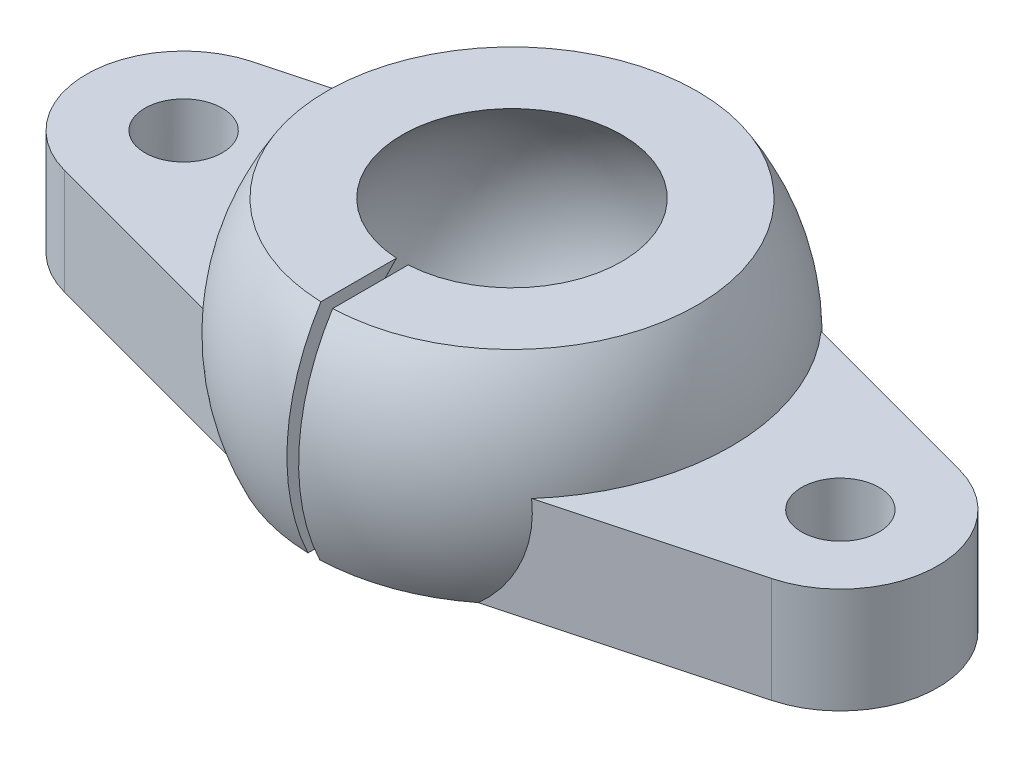
ISO-10303-21;
HEADER;
FILE_DESCRIPTION(('STEP AP214'),'2;1');
FILE_NAME('part.step','',(''),(''),'','','');
FILE_SCHEMA(('AUTOMOTIVE_DESIGN { 1 0 10303 214 1 1 1 1 }'));
ENDSEC;
DATA;
#1=APPLICATION_CONTEXT('core data for automotive mechanical design processes');
#2=APPLICATION_PROTOCOL_DEFINITION('international standard','automotive_design',2000,#1);
#3=PRODUCT_CONTEXT('',#1,'mechanical');
#4=PRODUCT('Part','Part','',(#3));
#5=PRODUCT_RELATED_PRODUCT_CATEGORY('part','',(#4));
#6=PRODUCT_DEFINITION_FORMATION('','',#4);
#7=PRODUCT_DEFINITION_CONTEXT('part definition',#1,'design');
#8=PRODUCT_DEFINITION('design','',#6,#7);
#9=PRODUCT_DEFINITION_SHAPE('','',#8);
#10=(LENGTH_UNIT() NAMED_UNIT(*) SI_UNIT(.MILLI.,.METRE.));
#11=(NAMED_UNIT(*) PLANE_ANGLE_UNIT() SI_UNIT($,.RADIAN.));
#12=(NAMED_UNIT(*) SI_UNIT($,.STERADIAN.) SOLID_ANGLE_UNIT());
#13=UNCERTAINTY_MEASURE_WITH_UNIT(LENGTH_MEASURE(1.E-05),#10,'distance_accuracy_value','');
#14=(GEOMETRIC_REPRESENTATION_CONTEXT(3) GLOBAL_UNCERTAINTY_ASSIGNED_CONTEXT((#13)) GLOBAL_UNIT_ASSIGNED_CONTEXT((#10,
#11,#12)) REPRESENTATION_CONTEXT('',''));
#15=CARTESIAN_POINT('',(0.,0.,0.));
#16=DIRECTION('',(0.,0.,1.));
#17=DIRECTION('',(1.,0.,0.));
#18=AXIS2_PLACEMENT_3D('',#15,#16,#17);
#19=CARTESIAN_POINT('',(0.,0.,0.));
#20=DIRECTION('',(0.,1.,0.));
#21=DIRECTION('',(-1.,0.,0.));
#22=AXIS2_PLACEMENT_3D('',#19,#20,#21);
#23=SPHERICAL_SURFACE('',#22,6.85);
#24=CARTESIAN_POINT('',(-0.25,0.,0.));
#25=DIRECTION('',(-1.,0.,0.));
#26=DIRECTION('',(0.,-1.,0.));
#27=AXIS2_PLACEMENT_3D('',#24,#25,#26);
#28=CIRCLE('',#27,6.84543643604993);
#29=CARTESIAN_POINT('',(-0.25,-3.56370593624109,5.84465567848098));
#30=VERTEX_POINT('',#29);
#31=CARTESIAN_POINT('',(-0.250000000000003,5.,4.67546789102438));
#32=VERTEX_POINT('',#31);
#33=EDGE_CURVE('E307',#30,#32,#28,.T.);
#34=ORIENTED_EDGE('',*,*,#33,.F.);
#35=CARTESIAN_POINT('',(0.,-3.56370593624109,0.));
#36=DIRECTION('',(0.,1.,0.));
#37=DIRECTION('',(-1.,0.,0.));
#38=AXIS2_PLACEMENT_3D('',#35,#36,#37);
#39=CIRCLE('',#38,5.85);
#40=CARTESIAN_POINT('',(0.25,-3.56370593624109,5.84465567848098));
#41=VERTEX_POINT('',#40);
#42=EDGE_CURVE('E303',#41,#30,#39,.T.);
#43=ORIENTED_EDGE('',*,*,#42,.F.);
#44=CARTESIAN_POINT('',(0.25,0.,0.));
#45=DIRECTION('',(-1.,0.,0.));
#46=DIRECTION('',(0.,-1.,0.));
#47=AXIS2_PLACEMENT_3D('',#44,#45,#46);
#48=CIRCLE('',#47,6.84543643604993);
#49=CARTESIAN_POINT('',(0.249999999999997,5.,4.67546789102438));
#50=VERTEX_POINT('',#49);
#51=EDGE_CURVE('E64',#41,#50,#48,.T.);
#52=ORIENTED_EDGE('',*,*,#51,.T.);
#53=CARTESIAN_POINT('',(0.,5.,0.));
#54=DIRECTION('',(0.,1.,0.));
#55=DIRECTION('',(-1.,0.,0.));
#56=AXIS2_PLACEMENT_3D('',#53,#54,#55);
#57=CIRCLE('',#56,4.68214694344378);
#58=EDGE_CURVE('E167',#50,#32,#57,.T.);
#59=ORIENTED_EDGE('',*,*,#58,.T.);
#60=EDGE_LOOP('',(#34,#43,#52,#59));
#61=FACE_BOUND('',#60,.T.);
#62=ADVANCED_FACE('F35',(#61),#23,.F.);
#63=CARTESIAN_POINT('',(-7.90079109963047,5.,0.));
#64=DIRECTION('',(0.,1.,0.));
#65=DIRECTION('',(-1.,0.,0.));
#66=AXIS2_PLACEMENT_3D('',#63,#64,#65);
#67=PLANE('',#66);
#68=DIRECTION('',(0.,0.,1.));
#69=VECTOR('',#68,1.);
#70=CARTESIAN_POINT('',(-0.250000000000001,5.,0.));
#71=LINE('',#70,#69);
#72=CARTESIAN_POINT('',(-0.250000000000003,5.,7.89683480895985));
#73=VERTEX_POINT('',#72);
#74=EDGE_CURVE('E137',#32,#73,#71,.T.);
#75=ORIENTED_EDGE('',*,*,#74,.F.);
#76=ORIENTED_EDGE('',*,*,#58,.F.);
#77=DIRECTION('',(0.,0.,1.));
#78=VECTOR('',#77,1.);
#79=CARTESIAN_POINT('',(0.249999999999999,5.,0.));
#80=LINE('',#79,#78);
#81=CARTESIAN_POINT('',(0.249999999999997,5.,7.89683480895985));
#82=VERTEX_POINT('',#81);
#83=EDGE_CURVE('E312',#50,#82,#80,.T.);
#84=ORIENTED_EDGE('',*,*,#83,.T.);
#85=CARTESIAN_POINT('',(0.,5.,0.));
#86=DIRECTION('',(0.,1.,0.));
#87=DIRECTION('',(-1.,0.,0.));
#88=AXIS2_PLACEMENT_3D('',#85,#86,#87);
#89=CIRCLE('',#88,7.90079109963047);
#90=EDGE_CURVE('E162',#82,#73,#89,.T.);
#91=ORIENTED_EDGE('',*,*,#90,.T.);
#92=EDGE_LOOP('',(#75,#76,#84,#91));
#93=FACE_BOUND('',#92,.T.);
#94=ADVANCED_FACE('F245',(#93),#67,.T.);
#95=CARTESIAN_POINT('',(0.,0.,0.));
#96=DIRECTION('',(0.,1.,0.));
#97=DIRECTION('',(-1.,0.,0.));
#98=AXIS2_PLACEMENT_3D('',#95,#96,#97);
#99=SPHERICAL_SURFACE('',#98,9.35);
#100=CARTESIAN_POINT('',(-0.25,0.,0.));
#101=DIRECTION('',(-1.,0.,0.));
#102=DIRECTION('',(0.,-1.,0.));
#103=AXIS2_PLACEMENT_3D('',#100,#101,#102);
#104=CIRCLE('',#103,9.34665715643834);
#105=CARTESIAN_POINT('',(-0.250000000000001,-4.00000000000001,8.44748483277715));
#106=VERTEX_POINT('',#105);
#107=EDGE_CURVE('E134',#73,#106,#104,.F.);
#108=ORIENTED_EDGE('',*,*,#107,.F.);
#109=ORIENTED_EDGE('',*,*,#90,.F.);
#110=CARTESIAN_POINT('',(0.25,0.,0.));
#111=DIRECTION('',(-1.,0.,0.));
#112=DIRECTION('',(0.,-1.,0.));
#113=AXIS2_PLACEMENT_3D('',#110,#111,#112);
#114=CIRCLE('',#113,9.34665715643834);
#115=CARTESIAN_POINT('',(0.249999999999999,-4.00000000000001,8.44748483277715));
#116=VERTEX_POINT('',#115);
#117=EDGE_CURVE('E308',#82,#116,#114,.F.);
#118=ORIENTED_EDGE('',*,*,#117,.T.);
#119=CARTESIAN_POINT('',(0.,-4.,0.));
#120=DIRECTION('',(0.,1.,0.));
#121=DIRECTION('',(-1.,0.,0.));
#122=AXIS2_PLACEMENT_3D('',#119,#120,#121);
#123=CIRCLE('',#122,8.45118334909378);
#124=CARTESIAN_POINT('',(5.21491093730875,-4.,6.65035366848543));
#125=VERTEX_POINT('',#124);
#126=EDGE_CURVE('E160',#116,#125,#123,.T.);
#127=ORIENTED_EDGE('',*,*,#126,.T.);
#128=CARTESIAN_POINT('',(2.01192121068436,0.,7.5085921790996));
#129=DIRECTION('',(0.258819045102518,0.,0.965925826289069));
#130=DIRECTION('',(0.965925826289069,0.,-0.258819045102518));
#131=AXIS2_PLACEMENT_3D('',#128,#129,#130);
#132=CIRCLE('',#131,5.19574022926114);
#133=CARTESIAN_POINT('',(7.00732842568334,0.500000000000003,6.17007684997604));
#134=VERTEX_POINT('',#133);
#135=EDGE_CURVE('E297',#134,#125,#132,.F.);
#136=ORIENTED_EDGE('',*,*,#135,.F.);
#137=CARTESIAN_POINT('',(0.,0.5,0.));
#138=DIRECTION('',(0.,-1.,0.));
#139=DIRECTION('',(1.,0.,0.));
#140=AXIS2_PLACEMENT_3D('',#137,#138,#139);
#141=CIRCLE('',#140,9.33662144461261);
#142=CARTESIAN_POINT('',(7.00732842568334,0.500000000000003,-6.17007684997604));
#143=VERTEX_POINT('',#142);
#144=EDGE_CURVE('E170',#134,#143,#141,.F.);
#145=ORIENTED_EDGE('',*,*,#144,.T.);
#146=CARTESIAN_POINT('',(2.01192121068436,0.,-7.5085921790996));
#147=DIRECTION('',(0.258819045102518,0.,-0.965925826289069));
#148=DIRECTION('',(-0.965925826289069,0.,-0.258819045102518));
#149=AXIS2_PLACEMENT_3D('',#146,#147,#148);
#150=CIRCLE('',#149,5.19574022926114);
#151=CARTESIAN_POINT('',(5.21491093730875,-4.,-6.65035366848543));
#152=VERTEX_POINT('',#151);
#153=EDGE_CURVE('E301',#152,#143,#150,.F.);
#154=ORIENTED_EDGE('',*,*,#153,.F.);
#155=CARTESIAN_POINT('',(-5.21491093730875,-4.,-6.65035366848543));
#156=VERTEX_POINT('',#155);
#157=EDGE_CURVE('E159',#152,#156,#123,.T.);
#158=ORIENTED_EDGE('',*,*,#157,.T.);
#159=CARTESIAN_POINT('',(-2.01192121068436,0.,-7.5085921790996));
#160=DIRECTION('',(-0.258819045102518,0.,-0.965925826289069));
#161=DIRECTION('',(-0.965925826289069,0.,0.258819045102518));
#162=AXIS2_PLACEMENT_3D('',#159,#160,#161);
#163=CIRCLE('',#162,5.19574022926114);
#164=CARTESIAN_POINT('',(-7.00732842568334,0.499999999999998,-6.17007684997604));
#165=VERTEX_POINT('',#164);
#166=EDGE_CURVE('E277',#165,#156,#163,.F.);
#167=ORIENTED_EDGE('',*,*,#166,.F.);
#168=CARTESIAN_POINT('',(0.,0.5,0.));
#169=DIRECTION('',(0.,-1.,0.));
#170=DIRECTION('',(1.,0.,0.));
#171=AXIS2_PLACEMENT_3D('',#168,#169,#170);
#172=CIRCLE('',#171,9.33662144461261);
#173=CARTESIAN_POINT('',(-7.00732842568334,0.499999999999998,6.17007684997604));
#174=VERTEX_POINT('',#173);
#175=EDGE_CURVE('E172',#165,#174,#172,.F.);
#176=ORIENTED_EDGE('',*,*,#175,.T.);
#177=CARTESIAN_POINT('',(-2.01192121068436,0.,7.50859217909961));
#178=DIRECTION('',(-0.258819045102518,0.,0.965925826289069));
#179=DIRECTION('',(0.965925826289069,0.,0.258819045102518));
#180=AXIS2_PLACEMENT_3D('',#177,#178,#179);
#181=CIRCLE('',#180,5.19574022926114);
#182=CARTESIAN_POINT('',(-5.21491093730875,-4.,6.65035366848543));
#183=VERTEX_POINT('',#182);
#184=EDGE_CURVE('E157',#183,#174,#181,.F.);
#185=ORIENTED_EDGE('',*,*,#184,.F.);
#186=EDGE_CURVE('E148',#183,#106,#123,.T.);
#187=ORIENTED_EDGE('',*,*,#186,.T.);
#188=EDGE_LOOP('',(#108,#109,#118,#127,#136,#145,#154,#158,#167,#176,#185,#187));
#189=FACE_BOUND('',#188,.T.);
#190=ADVANCED_FACE('F155',(#189),#99,.T.);
#191=CARTESIAN_POINT('',(-6.56619833921587,-4.,0.));
#192=DIRECTION('',(0.,-1.,0.));
#193=DIRECTION('',(1.,0.,0.));
#194=AXIS2_PLACEMENT_3D('',#191,#192,#193);
#195=PLANE('',#194);
#196=DIRECTION('',(0.,0.,1.));
#197=VECTOR('',#196,1.);
#198=CARTESIAN_POINT('',(-0.249999999999999,-4.00000000000001,0.));
#199=LINE('',#198,#197);
#200=CARTESIAN_POINT('',(-0.25,-4.,6.5614373905358));
#201=VERTEX_POINT('',#200);
#202=EDGE_CURVE('E56',#201,#106,#199,.T.);
#203=ORIENTED_EDGE('',*,*,#202,.T.);
#204=ORIENTED_EDGE('',*,*,#186,.F.);
#205=DIRECTION('',(-0.965925826289069,0.,-0.258819045102518));
#206=VECTOR('',#205,1.);
#207=CARTESIAN_POINT('',(-15.0740990371754,-4.,4.00859217909964));
#208=LINE('',#207,#206);
#209=CARTESIAN_POINT('',(-15.0740990371754,-4.,4.00859217909964));
#210=VERTEX_POINT('',#209);
#211=EDGE_CURVE('E323',#183,#210,#208,.T.);
#212=ORIENTED_EDGE('',*,*,#211,.T.);
#213=CARTESIAN_POINT('',(-14.,-4.,0.));
#214=DIRECTION('',(0.,-1.,0.));
#215=DIRECTION('',(1.,0.,0.));
#216=AXIS2_PLACEMENT_3D('',#213,#214,#215);
#217=CIRCLE('',#216,4.15);
#218=CARTESIAN_POINT('',(-15.0740990371754,-4.,-4.00859217909964));
#219=VERTEX_POINT('',#218);
#220=EDGE_CURVE('E318',#210,#219,#217,.T.);
#221=ORIENTED_EDGE('',*,*,#220,.T.);
#222=DIRECTION('',(0.965925826289069,0.,-0.258819045102518));
#223=VECTOR('',#222,1.);
#224=CARTESIAN_POINT('',(-3.37648299815732,-4.,-7.14295895012386));
#225=LINE('',#224,#223);
#226=EDGE_CURVE('E331',#219,#156,#225,.T.);
#227=ORIENTED_EDGE('',*,*,#226,.T.);
#228=ORIENTED_EDGE('',*,*,#157,.F.);
#229=DIRECTION('',(0.965925826289069,0.,0.258819045102518));
#230=VECTOR('',#229,1.);
#231=CARTESIAN_POINT('',(3.37648299815732,-4.,-7.14295895012386));
#232=LINE('',#231,#230);
#233=CARTESIAN_POINT('',(15.0740990371755,-3.99999999999999,-4.00859217909964));
#234=VERTEX_POINT('',#233);
#235=EDGE_CURVE('E285',#152,#234,#232,.T.);
#236=ORIENTED_EDGE('',*,*,#235,.T.);
#237=CARTESIAN_POINT('',(14.,-3.99999999999999,0.));
#238=DIRECTION('',(0.,-1.,0.));
#239=DIRECTION('',(1.,0.,0.));
#240=AXIS2_PLACEMENT_3D('',#237,#238,#239);
#241=CIRCLE('',#240,4.15);
#242=CARTESIAN_POINT('',(15.0740990371754,-3.99999999999999,4.00859217909964));
#243=VERTEX_POINT('',#242);
#244=EDGE_CURVE('E272',#234,#243,#241,.T.);
#245=ORIENTED_EDGE('',*,*,#244,.T.);
#246=DIRECTION('',(-0.965925826289069,0.,0.258819045102518));
#247=VECTOR('',#246,1.);
#248=CARTESIAN_POINT('',(15.0740990371754,-3.99999999999999,4.00859217909964));
#249=LINE('',#248,#247);
#250=EDGE_CURVE('E275',#243,#125,#249,.T.);
#251=ORIENTED_EDGE('',*,*,#250,.T.);
#252=ORIENTED_EDGE('',*,*,#126,.F.);
#253=DIRECTION('',(0.,0.,1.));
#254=VECTOR('',#253,1.);
#255=CARTESIAN_POINT('',(0.250000000000001,-4.00000000000001,0.));
#256=LINE('',#255,#254);
#257=CARTESIAN_POINT('',(0.25,-4.00000000000001,6.56143739053581));
#258=VERTEX_POINT('',#257);
#259=EDGE_CURVE('E153',#258,#116,#256,.T.);
#260=ORIENTED_EDGE('',*,*,#259,.F.);
#261=CARTESIAN_POINT('',(0.,-4.,0.));
#262=DIRECTION('',(0.,1.,0.));
#263=DIRECTION('',(-1.,0.,0.));
#264=AXIS2_PLACEMENT_3D('',#261,#262,#263);
#265=CIRCLE('',#264,6.56619833921587);
#266=EDGE_CURVE('E152',#258,#201,#265,.T.);
#267=ORIENTED_EDGE('',*,*,#266,.T.);
#268=EDGE_LOOP('',(#203,#204,#212,#221,#227,#228,#236,#245,#251,#252,#260,#267));
#269=FACE_BOUND('',#268,.T.);
#270=CARTESIAN_POINT('',(14.,-3.99999999999999,0.));
#271=DIRECTION('',(0.,-1.,0.));
#272=DIRECTION('',(1.,0.,0.));
#273=AXIS2_PLACEMENT_3D('',#270,#271,#272);
#274=CIRCLE('',#273,3.14999999999999);
#275=CARTESIAN_POINT('',(17.15,-3.99999999999999,0.));
#276=VERTEX_POINT('',#275);
#277=EDGE_CURVE('E180',#276,#276,#274,.F.);
#278=ORIENTED_EDGE('',*,*,#277,.T.);
#279=EDGE_LOOP('',(#278));
#280=FACE_BOUND('',#279,.T.);
#281=CARTESIAN_POINT('',(-14.,-4.,0.));
#282=DIRECTION('',(0.,-1.,0.));
#283=DIRECTION('',(1.,0.,0.));
#284=AXIS2_PLACEMENT_3D('',#281,#282,#283);
#285=CIRCLE('',#284,3.15000000000001);
#286=CARTESIAN_POINT('',(-10.85,-4.,0.));
#287=VERTEX_POINT('',#286);
#288=EDGE_CURVE('E177',#287,#287,#285,.F.);
#289=ORIENTED_EDGE('',*,*,#288,.T.);
#290=EDGE_LOOP('',(#289));
#291=FACE_BOUND('',#290,.T.);
#292=ADVANCED_FACE('F146',(#269,#280,#291),#195,.T.);
#293=CARTESIAN_POINT('',(0.,-4.,0.));
#294=DIRECTION('',(0.,-1.,0.));
#295=DIRECTION('',(1.,0.,0.));
#296=AXIS2_PLACEMENT_3D('',#293,#294,#295);
#297=CONICAL_SURFACE('',#296,6.56619833921587,1.02365378895935);
#298=CARTESIAN_POINT('',(-0.25,-4.0007,6.56258730886968));
#299=CARTESIAN_POINT('',(-0.25,-3.79203605968382,6.21979491039334));
#300=CARTESIAN_POINT('',(-0.25,-3.58338011025822,5.87699762131281));
#301=CARTESIAN_POINT('',(-0.25,-3.16612496373921,5.19136193314967));
#302=CARTESIAN_POINT('',(-0.25,-2.95752576748086,4.84852353355888));
#303=CARTESIAN_POINT('',(-0.25,-2.53926748953039,4.16087140498777));
#304=CARTESIAN_POINT('',(-0.25,-2.32960898600546,3.8160573244824));
#305=CARTESIAN_POINT('',(-0.25,-1.91049967216925,3.12630918369924));
#306=CARTESIAN_POINT('',(-0.25,-1.70104885908318,2.78137512510987));
#307=CARTESIAN_POINT('',(-0.25,-1.41538299560139,2.30996462605388));
#308=CARTESIAN_POINT('',(-0.25,-1.33889727185218,2.18365221667943));
#309=CARTESIAN_POINT('',(-0.25,-1.18606839080282,1.93093573838817));
#310=CARTESIAN_POINT('',(-0.25,-1.10972523795582,1.80453166677401));
#311=CARTESIAN_POINT('',(-0.25,-0.957514310010022,1.55190705866557));
#312=CARTESIAN_POINT('',(-0.25,-0.881645806424043,1.42568696048364));
#313=CARTESIAN_POINT('',(-0.25,-0.730429142164725,1.17294898469878));
#314=CARTESIAN_POINT('',(-0.25,-0.655080934891074,1.04643113516137));
#315=CARTESIAN_POINT('',(-0.25,-0.552756412658992,0.872338757139789));
#316=CARTESIAN_POINT('',(-0.25,-0.525148723513008,0.825136368574723));
#317=CARTESIAN_POINT('',(-0.25,-0.470273139245141,0.730520484331053));
#318=CARTESIAN_POINT('',(-0.25,-0.443005320769882,0.683106944193085));
#319=CARTESIAN_POINT('',(-0.25,-0.38888539201587,0.5876549449805));
#320=CARTESIAN_POINT('',(-0.25,-0.362036856629112,0.539614436692938));
#321=CARTESIAN_POINT('',(-0.25,-0.322661728981087,0.467077862729114));
#322=CARTESIAN_POINT('',(-0.25,-0.309688909797546,0.442824808098209));
#323=CARTESIAN_POINT('',(-0.25,-0.284196173906107,0.394082621666878));
#324=CARTESIAN_POINT('',(-0.25,-0.271676217966321,0.369593510550114));
#325=CARTESIAN_POINT('',(-0.25,-0.249566836729092,0.324767943894769));
#326=CARTESIAN_POINT('',(-0.25,-0.239859787385058,0.304489867526525));
#327=CARTESIAN_POINT('',(-0.25,-0.22116360840782,0.263608088254685));
#328=CARTESIAN_POINT('',(-0.25,-0.212174266350144,0.243004483878651));
#329=CARTESIAN_POINT('',(-0.25,-0.19540039459809,0.201555178192709));
#330=CARTESIAN_POINT('',(-0.25,-0.187604242941366,0.180714265584528));
#331=CARTESIAN_POINT('',(-0.25,-0.173758211726736,0.138471545690703));
#332=CARTESIAN_POINT('',(-0.25,-0.167705364282423,0.117070760151613));
#333=CARTESIAN_POINT('',(-0.25,-0.159597173477799,0.0796732806368716));
#334=CARTESIAN_POINT('',(-0.25,-0.156898971091526,0.0638215072081142));
#335=CARTESIAN_POINT('',(-0.25,-0.153206510816522,0.0317592753915554));
#336=CARTESIAN_POINT('',(-0.25,-0.152230243448775,0.0155468015782275));
#337=CARTESIAN_POINT('',(-0.25,-0.152295722476121,-0.000700000000000062));
#338=B_SPLINE_CURVE_WITH_KNOTS('',3,(#298,#299,#300,#301,#302,#303,#304,#305,#306,#307,#308,
#309,#310,#311,#312,#313,#314,#315,#316,#317,#318,#319,#320,#321,#322,#323,#324,#325,#326,#327,
#328,#329,#330,#331,#332,#333,#334,#335,#336,#337),.UNSPECIFIED.,.F.,.F.,(4,2,2,2,2,2,2,2,2,2,2,
2,2,2,2,2,2,2,2,4),(0.,1.20392089291616,2.40785863368443,3.61851178261971,4.82914853286378,
5.27214290352746,5.71515088701696,6.15695183477718,6.59871268560253,6.76276112611679,
6.92684591629358,7.09193697514014,7.17444811162307,7.25695208289951,7.3243887709009,
7.39180542465991,7.45851669046847,7.52511370319128,7.57326547989776,7.62191742391162),.UNSPECIFIED.);
#339=EDGE_CURVE('E11',#201,#30,#338,.T.);
#340=ORIENTED_EDGE('',*,*,#339,.F.);
#341=ORIENTED_EDGE('',*,*,#266,.F.);
#342=CARTESIAN_POINT('',(0.25,-4.0007,6.56258730886968));
#343=CARTESIAN_POINT('',(0.25,-3.79203605968382,6.21979491039334));
#344=CARTESIAN_POINT('',(0.25,-3.58338011025822,5.87699762131282));
#345=CARTESIAN_POINT('',(0.25,-3.16612496373921,5.19136193314968));
#346=CARTESIAN_POINT('',(0.25,-2.95752576748086,4.84852353355889));
#347=CARTESIAN_POINT('',(0.25,-2.5392674895304,4.16087140498779));
#348=CARTESIAN_POINT('',(0.25,-2.32960898600547,3.81605732448242));
#349=CARTESIAN_POINT('',(0.25,-1.91049967216927,3.12630918369926));
#350=CARTESIAN_POINT('',(0.25,-1.70104885908319,2.7813751251099));
#351=CARTESIAN_POINT('',(0.25,-1.41538299560141,2.3099646260539));
#352=CARTESIAN_POINT('',(0.25,-1.3388972718522,2.18365221667945));
#353=CARTESIAN_POINT('',(0.25,-1.18606839080283,1.93093573838819));
#354=CARTESIAN_POINT('',(0.25,-1.10972523795583,1.80453166677403));
#355=CARTESIAN_POINT('',(0.25,-0.957514310010032,1.55190705866558));
#356=CARTESIAN_POINT('',(0.25,-0.881645806424052,1.42568696048365));
#357=CARTESIAN_POINT('',(0.25,-0.730429142164732,1.17294898469879));
#358=CARTESIAN_POINT('',(0.25,-0.655080934891081,1.04643113516138));
#359=CARTESIAN_POINT('',(0.25,-0.552756412658997,0.872338757139797));
#360=CARTESIAN_POINT('',(0.25,-0.525148723513013,0.825136368574731));
#361=CARTESIAN_POINT('',(0.25,-0.470273139245145,0.73052048433106));
#362=CARTESIAN_POINT('',(0.25,-0.443005320769886,0.683106944193091));
#363=CARTESIAN_POINT('',(0.25,-0.388885392015873,0.587654944980505));
#364=CARTESIAN_POINT('',(0.25,-0.362036856629115,0.539614436692943));
#365=CARTESIAN_POINT('',(0.25,-0.32266172898109,0.467077862729118));
#366=CARTESIAN_POINT('',(0.25,-0.309688909797548,0.442824808098213));
#367=CARTESIAN_POINT('',(0.25,-0.284196173906109,0.394082621666881));
#368=CARTESIAN_POINT('',(0.25,-0.271676217966323,0.369593510550117));
#369=CARTESIAN_POINT('',(0.25,-0.249566836729094,0.324767943894772));
#370=CARTESIAN_POINT('',(0.25,-0.239859787385059,0.304489867526528));
#371=CARTESIAN_POINT('',(0.25,-0.221163608407821,0.263608088254689));
#372=CARTESIAN_POINT('',(0.25,-0.212174266350146,0.243004483878654));
#373=CARTESIAN_POINT('',(0.25,-0.195400394598092,0.201555178192711));
#374=CARTESIAN_POINT('',(0.25,-0.187604242941366,0.18071426558453));
#375=CARTESIAN_POINT('',(0.25,-0.173758211726737,0.138471545690704));
#376=CARTESIAN_POINT('',(0.25,-0.167705364282425,0.117070760151614));
#377=CARTESIAN_POINT('',(0.25,-0.159597173477801,0.0796732806368725));
#378=CARTESIAN_POINT('',(0.25,-0.156898971091527,0.063821507208115));
#379=CARTESIAN_POINT('',(0.25,-0.153206510816523,0.0317592753915559));
#380=CARTESIAN_POINT('',(0.25,-0.152230243448775,0.0155468015782278));
#381=CARTESIAN_POINT('',(0.25,-0.152295722476122,-0.000700000000000029));
#382=B_SPLINE_CURVE_WITH_KNOTS('',3,(#342,#343,#344,#345,#346,#347,#348,#349,#350,#351,#352,
#353,#354,#355,#356,#357,#358,#359,#360,#361,#362,#363,#364,#365,#366,#367,#368,#369,#370,#371,
#372,#373,#374,#375,#376,#377,#378,#379,#380,#381),.UNSPECIFIED.,.F.,.F.,(4,2,2,2,2,2,2,2,2,2,2,
2,2,2,2,2,2,2,2,4),(0.,1.20392089291615,2.40785863368442,3.61851178261969,4.82914853286375,
5.27214290352744,5.71515088701694,6.15695183477717,6.59871268560252,6.76276112611678,
6.92684591629357,7.09193697514014,7.17444811162307,7.25695208289951,7.3243887709009,
7.39180542465991,7.45851669046847,7.52511370319127,7.57326547989776,7.62191742391162),.UNSPECIFIED.);
#383=EDGE_CURVE('E50',#258,#41,#382,.T.);
#384=ORIENTED_EDGE('',*,*,#383,.T.);
#385=ORIENTED_EDGE('',*,*,#42,.T.);
#386=EDGE_LOOP('',(#340,#341,#384,#385));
#387=FACE_BOUND('',#386,.T.);
#388=ADVANCED_FACE('F190',(#387),#297,.F.);
#389=CARTESIAN_POINT('',(14.,0.500000000000005,0.));
#390=DIRECTION('',(0.,-1.,0.));
#391=DIRECTION('',(1.,0.,0.));
#392=AXIS2_PLACEMENT_3D('',#389,#390,#391);
#393=CYLINDRICAL_SURFACE('',#392,4.15);
#394=ORIENTED_EDGE('',*,*,#244,.F.);
#395=DIRECTION('',(0.,-1.,0.));
#396=VECTOR('',#395,1.);
#397=CARTESIAN_POINT('',(15.0740990371755,0.500000000000005,-4.00859217909964));
#398=LINE('',#397,#396);
#399=CARTESIAN_POINT('',(15.0740990371755,0.500000000000005,-4.00859217909964));
#400=VERTEX_POINT('',#399);
#401=EDGE_CURVE('E294',#400,#234,#398,.T.);
#402=ORIENTED_EDGE('',*,*,#401,.F.);
#403=CARTESIAN_POINT('',(14.,0.500000000000005,0.));
#404=DIRECTION('',(0.,-1.,0.));
#405=DIRECTION('',(1.,0.,0.));
#406=AXIS2_PLACEMENT_3D('',#403,#404,#405);
#407=CIRCLE('',#406,4.15);
#408=CARTESIAN_POINT('',(15.0740990371754,0.500000000000005,4.00859217909964));
#409=VERTEX_POINT('',#408);
#410=EDGE_CURVE('E281',#400,#409,#407,.T.);
#411=ORIENTED_EDGE('',*,*,#410,.T.);
#412=DIRECTION('',(0.,-1.,0.));
#413=VECTOR('',#412,1.);
#414=CARTESIAN_POINT('',(15.0740990371754,0.500000000000005,4.00859217909964));
#415=LINE('',#414,#413);
#416=EDGE_CURVE('E289',#409,#243,#415,.T.);
#417=ORIENTED_EDGE('',*,*,#416,.T.);
#418=EDGE_LOOP('',(#394,#402,#411,#417));
#419=FACE_BOUND('',#418,.T.);
#420=ADVANCED_FACE('F233',(#419),#393,.T.);
#421=CARTESIAN_POINT('',(3.37648299815732,0.500000000000001,-7.14295895012386));
#422=DIRECTION('',(0.258819045102518,0.,-0.965925826289069));
#423=DIRECTION('',(-0.965925826289069,0.,-0.258819045102518));
#424=AXIS2_PLACEMENT_3D('',#421,#422,#423);
#425=PLANE('',#424);
#426=ORIENTED_EDGE('',*,*,#235,.F.);
#427=ORIENTED_EDGE('',*,*,#153,.T.);
#428=DIRECTION('',(0.965925826289069,0.,0.258819045102518));
#429=VECTOR('',#428,1.);
#430=CARTESIAN_POINT('',(3.37648299815732,0.500000000000001,-7.14295895012386));
#431=LINE('',#430,#429);
#432=EDGE_CURVE('E288',#143,#400,#431,.T.);
#433=ORIENTED_EDGE('',*,*,#432,.T.);
#434=ORIENTED_EDGE('',*,*,#401,.T.);
#435=EDGE_LOOP('',(#426,#427,#433,#434));
#436=FACE_BOUND('',#435,.T.);
#437=ADVANCED_FACE('F230',(#436),#425,.T.);
#438=CARTESIAN_POINT('',(15.0740990371754,0.500000000000005,4.00859217909964));
#439=DIRECTION('',(0.258819045102518,0.,0.965925826289069));
#440=DIRECTION('',(0.965925826289069,0.,-0.258819045102518));
#441=AXIS2_PLACEMENT_3D('',#438,#439,#440);
#442=PLANE('',#441);
#443=DIRECTION('',(-0.965925826289069,0.,0.258819045102518));
#444=VECTOR('',#443,1.);
#445=CARTESIAN_POINT('',(15.0740990371754,0.500000000000005,4.00859217909964));
#446=LINE('',#445,#444);
#447=EDGE_CURVE('E284',#409,#134,#446,.T.);
#448=ORIENTED_EDGE('',*,*,#447,.T.);
#449=ORIENTED_EDGE('',*,*,#135,.T.);
#450=ORIENTED_EDGE('',*,*,#250,.F.);
#451=ORIENTED_EDGE('',*,*,#416,.F.);
#452=EDGE_LOOP('',(#448,#449,#450,#451));
#453=FACE_BOUND('',#452,.T.);
#454=ADVANCED_FACE('F228',(#453),#442,.T.);
#455=CARTESIAN_POINT('',(14.,0.500000000000005,0.));
#456=DIRECTION('',(0.,-1.,0.));
#457=DIRECTION('',(1.,0.,0.));
#458=AXIS2_PLACEMENT_3D('',#455,#456,#457);
#459=PLANE('',#458);
#460=ORIENTED_EDGE('',*,*,#144,.F.);
#461=ORIENTED_EDGE('',*,*,#447,.F.);
#462=ORIENTED_EDGE('',*,*,#410,.F.);
#463=ORIENTED_EDGE('',*,*,#432,.F.);
#464=EDGE_LOOP('',(#460,#461,#462,#463));
#465=FACE_BOUND('',#464,.T.);
#466=CARTESIAN_POINT('',(14.,0.500000000000005,0.));
#467=DIRECTION('',(0.,-1.,0.));
#468=DIRECTION('',(1.,0.,0.));
#469=AXIS2_PLACEMENT_3D('',#466,#467,#468);
#470=CIRCLE('',#469,1.65);
#471=CARTESIAN_POINT('',(15.65,0.500000000000005,0.));
#472=VERTEX_POINT('',#471);
#473=EDGE_CURVE('E270',#472,#472,#470,.T.);
#474=ORIENTED_EDGE('',*,*,#473,.T.);
#475=EDGE_LOOP('',(#474));
#476=FACE_BOUND('',#475,.T.);
#477=ADVANCED_FACE('F224',(#465,#476),#459,.F.);
#478=CARTESIAN_POINT('',(14.,0.500000000000005,0.));
#479=DIRECTION('',(0.,-1.,0.));
#480=DIRECTION('',(1.,0.,0.));
#481=AXIS2_PLACEMENT_3D('',#478,#479,#480);
#482=CYLINDRICAL_SURFACE('',#481,1.65);
#483=CARTESIAN_POINT('',(14.,-2.50000000000001,0.));
#484=DIRECTION('',(0.,-1.,0.));
#485=DIRECTION('',(0.,0.,-1.));
#486=AXIS2_PLACEMENT_3D('',#483,#484,#485);
#487=CIRCLE('',#486,1.65);
#488=CARTESIAN_POINT('',(14.,-2.50000000000001,-1.65));
#489=VERTEX_POINT('',#488);
#490=EDGE_CURVE('E174',#489,#489,#487,.T.);
#491=ORIENTED_EDGE('',*,*,#490,.T.);
#492=EDGE_LOOP('',(#491));
#493=FACE_BOUND('',#492,.T.);
#494=ORIENTED_EDGE('',*,*,#473,.F.);
#495=EDGE_LOOP('',(#494));
#496=FACE_BOUND('',#495,.T.);
#497=ADVANCED_FACE('F220',(#493,#496),#482,.F.);
#498=CARTESIAN_POINT('',(-14.,0.499999999999996,0.));
#499=DIRECTION('',(0.,-1.,0.));
#500=DIRECTION('',(1.,0.,0.));
#501=AXIS2_PLACEMENT_3D('',#498,#499,#500);
#502=CYLINDRICAL_SURFACE('',#501,4.15);
#503=ORIENTED_EDGE('',*,*,#220,.F.);
#504=DIRECTION('',(0.,-1.,0.));
#505=VECTOR('',#504,1.);
#506=CARTESIAN_POINT('',(-15.0740990371755,0.499999999999996,4.00859217909964));
#507=LINE('',#506,#505);
#508=CARTESIAN_POINT('',(-15.0740990371755,0.499999999999996,4.00859217909964));
#509=VERTEX_POINT('',#508);
#510=EDGE_CURVE('E335',#509,#210,#507,.T.);
#511=ORIENTED_EDGE('',*,*,#510,.F.);
#512=CARTESIAN_POINT('',(-14.,0.499999999999996,0.));
#513=DIRECTION('',(0.,-1.,0.));
#514=DIRECTION('',(1.,0.,0.));
#515=AXIS2_PLACEMENT_3D('',#512,#513,#514);
#516=CIRCLE('',#515,4.15);
#517=CARTESIAN_POINT('',(-15.0740990371755,0.499999999999996,-4.00859217909964));
#518=VERTEX_POINT('',#517);
#519=EDGE_CURVE('E319',#509,#518,#516,.T.);
#520=ORIENTED_EDGE('',*,*,#519,.T.);
#521=DIRECTION('',(0.,-1.,0.));
#522=VECTOR('',#521,1.);
#523=CARTESIAN_POINT('',(-15.0740990371755,0.499999999999996,-4.00859217909964));
#524=LINE('',#523,#522);
#525=EDGE_CURVE('E328',#518,#219,#524,.T.);
#526=ORIENTED_EDGE('',*,*,#525,.T.);
#527=EDGE_LOOP('',(#503,#511,#520,#526));
#528=FACE_BOUND('',#527,.T.);
#529=ADVANCED_FACE('F213',(#528),#502,.T.);
#530=CARTESIAN_POINT('',(-15.0740990371755,0.499999999999996,4.00859217909964));
#531=DIRECTION('',(-0.258819045102518,0.,0.965925826289069));
#532=DIRECTION('',(0.965925826289069,0.,0.258819045102518));
#533=AXIS2_PLACEMENT_3D('',#530,#531,#532);
#534=PLANE('',#533);
#535=ORIENTED_EDGE('',*,*,#211,.F.);
#536=ORIENTED_EDGE('',*,*,#184,.T.);
#537=DIRECTION('',(-0.965925826289069,0.,-0.258819045102518));
#538=VECTOR('',#537,1.);
#539=CARTESIAN_POINT('',(-15.0740990371755,0.499999999999996,4.00859217909964));
#540=LINE('',#539,#538);
#541=EDGE_CURVE('E326',#174,#509,#540,.T.);
#542=ORIENTED_EDGE('',*,*,#541,.T.);
#543=ORIENTED_EDGE('',*,*,#510,.T.);
#544=EDGE_LOOP('',(#535,#536,#542,#543));
#545=FACE_BOUND('',#544,.T.);
#546=ADVANCED_FACE('F210',(#545),#534,.T.);
#547=CARTESIAN_POINT('',(-3.37648299815732,0.5,-7.14295895012386));
#548=DIRECTION('',(-0.258819045102518,0.,-0.965925826289069));
#549=DIRECTION('',(-0.965925826289069,0.,0.258819045102518));
#550=AXIS2_PLACEMENT_3D('',#547,#548,#549);
#551=PLANE('',#550);
#552=DIRECTION('',(0.965925826289069,0.,-0.258819045102518));
#553=VECTOR('',#552,1.);
#554=CARTESIAN_POINT('',(-3.37648299815732,0.5,-7.14295895012386));
#555=LINE('',#554,#553);
#556=EDGE_CURVE('E322',#518,#165,#555,.T.);
#557=ORIENTED_EDGE('',*,*,#556,.T.);
#558=ORIENTED_EDGE('',*,*,#166,.T.);
#559=ORIENTED_EDGE('',*,*,#226,.F.);
#560=ORIENTED_EDGE('',*,*,#525,.F.);
#561=EDGE_LOOP('',(#557,#558,#559,#560));
#562=FACE_BOUND('',#561,.T.);
#563=ADVANCED_FACE('F208',(#562),#551,.T.);
#564=CARTESIAN_POINT('',(-14.,0.499999999999996,0.));
#565=DIRECTION('',(0.,-1.,0.));
#566=DIRECTION('',(1.,0.,0.));
#567=AXIS2_PLACEMENT_3D('',#564,#565,#566);
#568=PLANE('',#567);
#569=ORIENTED_EDGE('',*,*,#175,.F.);
#570=ORIENTED_EDGE('',*,*,#556,.F.);
#571=ORIENTED_EDGE('',*,*,#519,.F.);
#572=ORIENTED_EDGE('',*,*,#541,.F.);
#573=EDGE_LOOP('',(#569,#570,#571,#572));
#574=FACE_BOUND('',#573,.T.);
#575=CARTESIAN_POINT('',(-14.,0.499999999999996,0.));
#576=DIRECTION('',(0.,-1.,0.));
#577=DIRECTION('',(1.,0.,0.));
#578=AXIS2_PLACEMENT_3D('',#575,#576,#577);
#579=CIRCLE('',#578,1.65);
#580=CARTESIAN_POINT('',(-12.35,0.499999999999997,0.));
#581=VERTEX_POINT('',#580);
#582=EDGE_CURVE('E142',#581,#581,#579,.T.);
#583=ORIENTED_EDGE('',*,*,#582,.T.);
#584=EDGE_LOOP('',(#583));
#585=FACE_BOUND('',#584,.T.);
#586=ADVANCED_FACE('F204',(#574,#585),#568,.F.);
#587=CARTESIAN_POINT('',(-14.,0.499999999999996,0.));
#588=DIRECTION('',(0.,-1.,0.));
#589=DIRECTION('',(1.,0.,0.));
#590=AXIS2_PLACEMENT_3D('',#587,#588,#589);
#591=CYLINDRICAL_SURFACE('',#590,1.65);
#592=CARTESIAN_POINT('',(-14.,-2.5,0.));
#593=DIRECTION('',(0.,-1.,0.));
#594=DIRECTION('',(0.,0.,-1.));
#595=AXIS2_PLACEMENT_3D('',#592,#593,#594);
#596=CIRCLE('',#595,1.65);
#597=CARTESIAN_POINT('',(-14.,-2.5,-1.65));
#598=VERTEX_POINT('',#597);
#599=EDGE_CURVE('E183',#598,#598,#596,.T.);
#600=ORIENTED_EDGE('',*,*,#599,.T.);
#601=EDGE_LOOP('',(#600));
#602=FACE_BOUND('',#601,.T.);
#603=ORIENTED_EDGE('',*,*,#582,.F.);
#604=EDGE_LOOP('',(#603));
#605=FACE_BOUND('',#604,.T.);
#606=ADVANCED_FACE('F200',(#602,#605),#591,.F.);
#607=CARTESIAN_POINT('',(14.,-2.50000000000001,0.));
#608=DIRECTION('',(0.,-1.,0.));
#609=DIRECTION('',(0.,0.,-1.));
#610=AXIS2_PLACEMENT_3D('',#607,#608,#609);
#611=CONICAL_SURFACE('',#610,1.65,0.78539816339745);
#612=ORIENTED_EDGE('',*,*,#277,.F.);
#613=EDGE_LOOP('',(#612));
#614=FACE_BOUND('',#613,.T.);
#615=ORIENTED_EDGE('',*,*,#490,.F.);
#616=EDGE_LOOP('',(#615));
#617=FACE_BOUND('',#616,.T.);
#618=ADVANCED_FACE('F203',(#614,#617),#611,.F.);
#619=CARTESIAN_POINT('',(-14.,-2.5,0.));
#620=DIRECTION('',(0.,-1.,0.));
#621=DIRECTION('',(0.,0.,-1.));
#622=AXIS2_PLACEMENT_3D('',#619,#620,#621);
#623=CONICAL_SURFACE('',#622,1.65,0.785398163397451);
#624=ORIENTED_EDGE('',*,*,#288,.F.);
#625=EDGE_LOOP('',(#624));
#626=FACE_BOUND('',#625,.T.);
#627=ORIENTED_EDGE('',*,*,#599,.F.);
#628=EDGE_LOOP('',(#627));
#629=FACE_BOUND('',#628,.T.);
#630=ADVANCED_FACE('F38',(#626,#629),#623,.F.);
#631=CARTESIAN_POINT('',(0.250000000000001,-4.00000000000001,0.));
#632=DIRECTION('',(-1.,0.,0.));
#633=DIRECTION('',(0.,-1.,0.));
#634=AXIS2_PLACEMENT_3D('',#631,#632,#633);
#635=PLANE('',#634);
#636=ORIENTED_EDGE('',*,*,#83,.F.);
#637=ORIENTED_EDGE('',*,*,#51,.F.);
#638=ORIENTED_EDGE('',*,*,#383,.F.);
#639=ORIENTED_EDGE('',*,*,#259,.T.);
#640=ORIENTED_EDGE('',*,*,#117,.F.);
#641=EDGE_LOOP('',(#636,#637,#638,#639,#640));
#642=FACE_BOUND('',#641,.T.);
#643=ADVANCED_FACE('F194',(#642),#635,.T.);
#644=CARTESIAN_POINT('',(-0.249999999999999,-4.00000000000001,0.));
#645=DIRECTION('',(-1.,0.,0.));
#646=DIRECTION('',(0.,-1.,0.));
#647=AXIS2_PLACEMENT_3D('',#644,#645,#646);
#648=PLANE('',#647);
#649=ORIENTED_EDGE('',*,*,#107,.T.);
#650=ORIENTED_EDGE('',*,*,#202,.F.);
#651=ORIENTED_EDGE('',*,*,#339,.T.);
#652=ORIENTED_EDGE('',*,*,#33,.T.);
#653=ORIENTED_EDGE('',*,*,#74,.T.);
#654=EDGE_LOOP('',(#649,#650,#651,#652,#653));
#655=FACE_BOUND('',#654,.T.);
#656=ADVANCED_FACE('F135',(#655),#648,.F.);
#657=CLOSED_SHELL('',(#62,#94,#190,#292,#388,#420,#437,#454,#477,#497,#529,#546,#563,#586,#606,
#618,#630,#643,#656));
#658=MANIFOLD_SOLID_BREP('B2',#657);
#659=ADVANCED_BREP_SHAPE_REPRESENTATION('',(#18,#658),#14);
#660=SHAPE_DEFINITION_REPRESENTATION(#9,#659);
ENDSEC;
END-ISO-10303-21;
